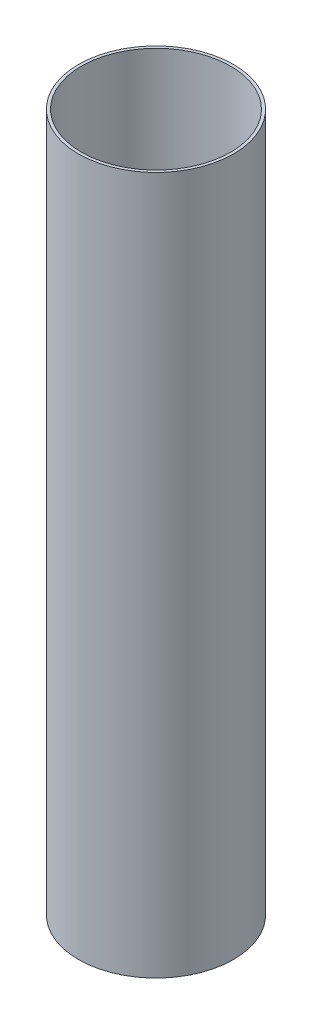
ISO-10303-21;
HEADER;
FILE_DESCRIPTION(('STEP AP214'),'2;1');
FILE_NAME('part.step','',(''),(''),'','','');
FILE_SCHEMA(('AUTOMOTIVE_DESIGN { 1 0 10303 214 1 1 1 1 }'));
ENDSEC;
DATA;
#1=APPLICATION_CONTEXT('core data for automotive mechanical design processes');
#2=APPLICATION_PROTOCOL_DEFINITION('international standard','automotive_design',2000,#1);
#3=PRODUCT_CONTEXT('',#1,'mechanical');
#4=PRODUCT('Part','Part','',(#3));
#5=PRODUCT_RELATED_PRODUCT_CATEGORY('part','',(#4));
#6=PRODUCT_DEFINITION_FORMATION('','',#4);
#7=PRODUCT_DEFINITION_CONTEXT('part definition',#1,'design');
#8=PRODUCT_DEFINITION('design','',#6,#7);
#9=PRODUCT_DEFINITION_SHAPE('','',#8);
#10=(LENGTH_UNIT() NAMED_UNIT(*) SI_UNIT(.MILLI.,.METRE.));
#11=(NAMED_UNIT(*) PLANE_ANGLE_UNIT() SI_UNIT($,.RADIAN.));
#12=(NAMED_UNIT(*) SI_UNIT($,.STERADIAN.) SOLID_ANGLE_UNIT());
#13=UNCERTAINTY_MEASURE_WITH_UNIT(LENGTH_MEASURE(1.E-05),#10,'distance_accuracy_value','');
#14=(GEOMETRIC_REPRESENTATION_CONTEXT(3) GLOBAL_UNCERTAINTY_ASSIGNED_CONTEXT((#13)) GLOBAL_UNIT_ASSIGNED_CONTEXT((#10,
#11,#12)) REPRESENTATION_CONTEXT('',''));
#15=CARTESIAN_POINT('',(0.,0.,0.));
#16=DIRECTION('',(0.,0.,1.));
#17=DIRECTION('',(1.,0.,0.));
#18=AXIS2_PLACEMENT_3D('',#15,#16,#17);
#19=CARTESIAN_POINT('',(0.,457.2,0.));
#20=DIRECTION('',(0.,1.,0.));
#21=DIRECTION('',(0.,0.,1.));
#22=AXIS2_PLACEMENT_3D('',#19,#20,#21);
#23=PLANE('',#22);
#24=CARTESIAN_POINT('',(0.,457.2,0.));
#25=DIRECTION('',(0.,1.,0.));
#26=DIRECTION('',(0.,0.,1.));
#27=AXIS2_PLACEMENT_3D('',#24,#25,#26);
#28=CIRCLE('',#27,101.6);
#29=CARTESIAN_POINT('',(0.,457.2,101.6));
#30=VERTEX_POINT('',#29);
#31=EDGE_CURVE('E10',#30,#30,#28,.T.);
#32=ORIENTED_EDGE('',*,*,#31,.T.);
#33=EDGE_LOOP('',(#32));
#34=FACE_BOUND('',#33,.T.);
#35=CARTESIAN_POINT('',(0.,457.2,0.));
#36=DIRECTION('',(0.,1.,0.));
#37=DIRECTION('',(0.,0.,1.));
#38=AXIS2_PLACEMENT_3D('',#35,#36,#37);
#39=CIRCLE('',#38,97.79);
#40=CARTESIAN_POINT('',(0.,457.2,97.79));
#41=VERTEX_POINT('',#40);
#42=EDGE_CURVE('E45',#41,#41,#39,.T.);
#43=ORIENTED_EDGE('',*,*,#42,.F.);
#44=EDGE_LOOP('',(#43));
#45=FACE_BOUND('',#44,.T.);
#46=ADVANCED_FACE('F34',(#34,#45),#23,.T.);
#47=CARTESIAN_POINT('',(0.,-457.2,0.));
#48=DIRECTION('',(0.,1.,0.));
#49=DIRECTION('',(0.,0.,1.));
#50=AXIS2_PLACEMENT_3D('',#47,#48,#49);
#51=PLANE('',#50);
#52=CARTESIAN_POINT('',(0.,-457.2,0.));
#53=DIRECTION('',(0.,1.,0.));
#54=DIRECTION('',(0.,0.,1.));
#55=AXIS2_PLACEMENT_3D('',#52,#53,#54);
#56=CIRCLE('',#55,101.6);
#57=CARTESIAN_POINT('',(0.,-457.2,101.6));
#58=VERTEX_POINT('',#57);
#59=EDGE_CURVE('E38',#58,#58,#56,.T.);
#60=ORIENTED_EDGE('',*,*,#59,.F.);
#61=EDGE_LOOP('',(#60));
#62=FACE_BOUND('',#61,.T.);
#63=CARTESIAN_POINT('',(0.,-457.2,0.));
#64=DIRECTION('',(0.,1.,0.));
#65=DIRECTION('',(0.,0.,1.));
#66=AXIS2_PLACEMENT_3D('',#63,#64,#65);
#67=CIRCLE('',#66,97.79);
#68=CARTESIAN_POINT('',(0.,-457.2,97.79));
#69=VERTEX_POINT('',#68);
#70=EDGE_CURVE('E47',#69,#69,#67,.T.);
#71=ORIENTED_EDGE('',*,*,#70,.T.);
#72=EDGE_LOOP('',(#71));
#73=FACE_BOUND('',#72,.T.);
#74=ADVANCED_FACE('F57',(#62,#73),#51,.F.);
#75=CARTESIAN_POINT('',(0.,457.2,0.));
#76=DIRECTION('',(0.,-1.,0.));
#77=DIRECTION('',(0.,0.,-1.));
#78=AXIS2_PLACEMENT_3D('',#75,#76,#77);
#79=CYLINDRICAL_SURFACE('',#78,101.6);
#80=ORIENTED_EDGE('',*,*,#31,.F.);
#81=EDGE_LOOP('',(#80));
#82=FACE_BOUND('',#81,.T.);
#83=ORIENTED_EDGE('',*,*,#59,.T.);
#84=EDGE_LOOP('',(#83));
#85=FACE_BOUND('',#84,.T.);
#86=ADVANCED_FACE('F36',(#82,#85),#79,.T.);
#87=CARTESIAN_POINT('',(0.,457.2,0.));
#88=DIRECTION('',(0.,-1.,0.));
#89=DIRECTION('',(0.,0.,-1.));
#90=AXIS2_PLACEMENT_3D('',#87,#88,#89);
#91=CYLINDRICAL_SURFACE('',#90,97.79);
#92=ORIENTED_EDGE('',*,*,#42,.T.);
#93=EDGE_LOOP('',(#92));
#94=FACE_BOUND('',#93,.T.);
#95=ORIENTED_EDGE('',*,*,#70,.F.);
#96=EDGE_LOOP('',(#95));
#97=FACE_BOUND('',#96,.T.);
#98=ADVANCED_FACE('F53',(#94,#97),#91,.F.);
#99=CLOSED_SHELL('',(#46,#74,#86,#98));
#100=MANIFOLD_SOLID_BREP('B2',#99);
#101=ADVANCED_BREP_SHAPE_REPRESENTATION('',(#18,#100),#14);
#102=SHAPE_DEFINITION_REPRESENTATION(#9,#101);
ENDSEC;
END-ISO-10303-21;
